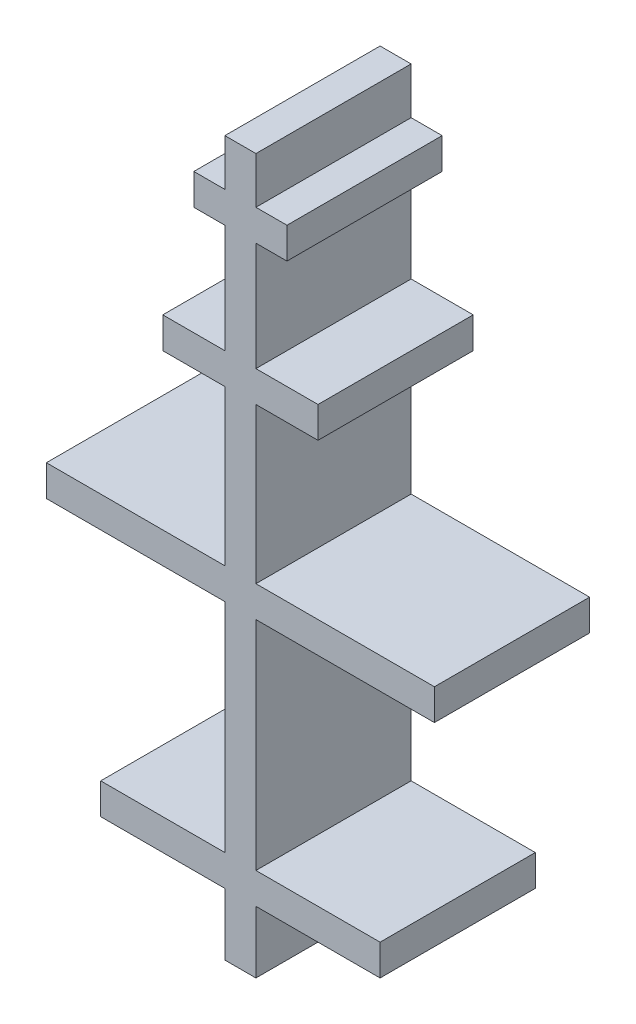
ISO-10303-21;
HEADER;
FILE_DESCRIPTION(('STEP AP214'),'2;1');
FILE_NAME('part.step','',(''),(''),'','','');
FILE_SCHEMA(('AUTOMOTIVE_DESIGN { 1 0 10303 214 1 1 1 1 }'));
ENDSEC;
DATA;
#1=APPLICATION_CONTEXT('core data for automotive mechanical design processes');
#2=APPLICATION_PROTOCOL_DEFINITION('international standard','automotive_design',2000,#1);
#3=PRODUCT_CONTEXT('',#1,'mechanical');
#4=PRODUCT('Part','Part','',(#3));
#5=PRODUCT_RELATED_PRODUCT_CATEGORY('part','',(#4));
#6=PRODUCT_DEFINITION_FORMATION('','',#4);
#7=PRODUCT_DEFINITION_CONTEXT('part definition',#1,'design');
#8=PRODUCT_DEFINITION('design','',#6,#7);
#9=PRODUCT_DEFINITION_SHAPE('','',#8);
#10=(LENGTH_UNIT() NAMED_UNIT(*) SI_UNIT(.MILLI.,.METRE.));
#11=(NAMED_UNIT(*) PLANE_ANGLE_UNIT() SI_UNIT($,.RADIAN.));
#12=(NAMED_UNIT(*) SI_UNIT($,.STERADIAN.) SOLID_ANGLE_UNIT());
#13=UNCERTAINTY_MEASURE_WITH_UNIT(LENGTH_MEASURE(1.E-05),#10,'distance_accuracy_value','');
#14=(GEOMETRIC_REPRESENTATION_CONTEXT(3) GLOBAL_UNCERTAINTY_ASSIGNED_CONTEXT((#13)) GLOBAL_UNIT_ASSIGNED_CONTEXT((#10,
#11,#12)) REPRESENTATION_CONTEXT('',''));
#15=CARTESIAN_POINT('',(0.,0.,0.));
#16=DIRECTION('',(0.,0.,1.));
#17=DIRECTION('',(1.,0.,0.));
#18=AXIS2_PLACEMENT_3D('',#15,#16,#17);
#19=CARTESIAN_POINT('',(0.,0.,50.));
#20=DIRECTION('',(1.,0.,0.));
#21=DIRECTION('',(0.,1.,0.));
#22=AXIS2_PLACEMENT_3D('',#19,#20,#21);
#23=PLANE('',#22);
#24=DIRECTION('',(0.,-1.,0.));
#25=VECTOR('',#24,1.);
#26=CARTESIAN_POINT('',(0.,0.,0.));
#27=LINE('',#26,#25);
#28=CARTESIAN_POINT('',(0.,20.,0.));
#29=VERTEX_POINT('',#28);
#30=CARTESIAN_POINT('',(0.,0.,0.));
#31=VERTEX_POINT('',#30);
#32=EDGE_CURVE('E308',#29,#31,#27,.T.);
#33=ORIENTED_EDGE('',*,*,#32,.T.);
#34=DIRECTION('',(0.,0.,-1.));
#35=VECTOR('',#34,1.);
#36=CARTESIAN_POINT('',(0.,0.,50.));
#37=LINE('',#36,#35);
#38=CARTESIAN_POINT('',(0.,0.,50.));
#39=VERTEX_POINT('',#38);
#40=EDGE_CURVE('E11',#39,#31,#37,.T.);
#41=ORIENTED_EDGE('',*,*,#40,.F.);
#42=DIRECTION('',(0.,-1.,0.));
#43=VECTOR('',#42,1.);
#44=CARTESIAN_POINT('',(0.,0.,50.));
#45=LINE('',#44,#43);
#46=CARTESIAN_POINT('',(0.,20.,50.));
#47=VERTEX_POINT('',#46);
#48=EDGE_CURVE('E414',#47,#39,#45,.T.);
#49=ORIENTED_EDGE('',*,*,#48,.F.);
#50=DIRECTION('',(0.,0.,-1.));
#51=VECTOR('',#50,1.);
#52=CARTESIAN_POINT('',(0.,20.,50.));
#53=LINE('',#52,#51);
#54=EDGE_CURVE('E304',#47,#29,#53,.T.);
#55=ORIENTED_EDGE('',*,*,#54,.T.);
#56=EDGE_LOOP('',(#33,#41,#49,#55));
#57=FACE_BOUND('',#56,.T.);
#58=ADVANCED_FACE('F39',(#57),#23,.F.);
#59=CARTESIAN_POINT('',(0.,0.,50.));
#60=DIRECTION('',(0.,1.,0.));
#61=DIRECTION('',(0.,0.,1.));
#62=AXIS2_PLACEMENT_3D('',#59,#60,#61);
#63=PLANE('',#62);
#64=DIRECTION('',(1.,0.,0.));
#65=VECTOR('',#64,1.);
#66=CARTESIAN_POINT('',(0.,0.,0.));
#67=LINE('',#66,#65);
#68=CARTESIAN_POINT('',(10.,0.,0.));
#69=VERTEX_POINT('',#68);
#70=EDGE_CURVE('E312',#31,#69,#67,.T.);
#71=ORIENTED_EDGE('',*,*,#70,.T.);
#72=DIRECTION('',(0.,0.,-1.));
#73=VECTOR('',#72,1.);
#74=CARTESIAN_POINT('',(10.,0.,50.));
#75=LINE('',#74,#73);
#76=CARTESIAN_POINT('',(10.,0.,50.));
#77=VERTEX_POINT('',#76);
#78=EDGE_CURVE('E48',#77,#69,#75,.T.);
#79=ORIENTED_EDGE('',*,*,#78,.F.);
#80=DIRECTION('',(1.,0.,0.));
#81=VECTOR('',#80,1.);
#82=CARTESIAN_POINT('',(0.,0.,50.));
#83=LINE('',#82,#81);
#84=EDGE_CURVE('E183',#39,#77,#83,.T.);
#85=ORIENTED_EDGE('',*,*,#84,.F.);
#86=ORIENTED_EDGE('',*,*,#40,.T.);
#87=EDGE_LOOP('',(#71,#79,#85,#86));
#88=FACE_BOUND('',#87,.T.);
#89=ADVANCED_FACE('F676',(#88),#63,.F.);
#90=CARTESIAN_POINT('',(10.,0.,50.));
#91=DIRECTION('',(-1.,0.,0.));
#92=DIRECTION('',(0.,-1.,0.));
#93=AXIS2_PLACEMENT_3D('',#90,#91,#92);
#94=PLANE('',#93);
#95=DIRECTION('',(0.,1.,0.));
#96=VECTOR('',#95,1.);
#97=CARTESIAN_POINT('',(10.,0.,0.));
#98=LINE('',#97,#96);
#99=CARTESIAN_POINT('',(9.99999999999999,20.,0.));
#100=VERTEX_POINT('',#99);
#101=EDGE_CURVE('E315',#69,#100,#98,.T.);
#102=ORIENTED_EDGE('',*,*,#101,.T.);
#103=DIRECTION('',(0.,0.,-1.));
#104=VECTOR('',#103,1.);
#105=CARTESIAN_POINT('',(9.99999999999999,20.,50.));
#106=LINE('',#105,#104);
#107=CARTESIAN_POINT('',(9.99999999999999,20.,50.));
#108=VERTEX_POINT('',#107);
#109=EDGE_CURVE('E537',#108,#100,#106,.T.);
#110=ORIENTED_EDGE('',*,*,#109,.F.);
#111=DIRECTION('',(0.,1.,0.));
#112=VECTOR('',#111,1.);
#113=CARTESIAN_POINT('',(10.,0.,50.));
#114=LINE('',#113,#112);
#115=EDGE_CURVE('E547',#77,#108,#114,.T.);
#116=ORIENTED_EDGE('',*,*,#115,.F.);
#117=ORIENTED_EDGE('',*,*,#78,.T.);
#118=EDGE_LOOP('',(#102,#110,#116,#117));
#119=FACE_BOUND('',#118,.T.);
#120=ADVANCED_FACE('F545',(#119),#94,.F.);
#121=CARTESIAN_POINT('',(9.99999999999999,20.,50.));
#122=DIRECTION('',(0.,1.,0.));
#123=DIRECTION('',(0.,0.,1.));
#124=AXIS2_PLACEMENT_3D('',#121,#122,#123);
#125=PLANE('',#124);
#126=DIRECTION('',(1.,0.,0.));
#127=VECTOR('',#126,1.);
#128=CARTESIAN_POINT('',(9.99999999999999,20.,0.));
#129=LINE('',#128,#127);
#130=CARTESIAN_POINT('',(50.,20.,0.));
#131=VERTEX_POINT('',#130);
#132=EDGE_CURVE('E318',#100,#131,#129,.T.);
#133=ORIENTED_EDGE('',*,*,#132,.T.);
#134=DIRECTION('',(0.,0.,-1.));
#135=VECTOR('',#134,1.);
#136=CARTESIAN_POINT('',(50.,20.,50.));
#137=LINE('',#136,#135);
#138=CARTESIAN_POINT('',(50.,20.,50.));
#139=VERTEX_POINT('',#138);
#140=EDGE_CURVE('E533',#139,#131,#137,.T.);
#141=ORIENTED_EDGE('',*,*,#140,.F.);
#142=DIRECTION('',(1.,0.,0.));
#143=VECTOR('',#142,1.);
#144=CARTESIAN_POINT('',(9.99999999999999,20.,50.));
#145=LINE('',#144,#143);
#146=EDGE_CURVE('E566',#108,#139,#145,.T.);
#147=ORIENTED_EDGE('',*,*,#146,.F.);
#148=ORIENTED_EDGE('',*,*,#109,.T.);
#149=EDGE_LOOP('',(#133,#141,#147,#148));
#150=FACE_BOUND('',#149,.T.);
#151=ADVANCED_FACE('F556',(#150),#125,.F.);
#152=CARTESIAN_POINT('',(50.,30.,50.));
#153=DIRECTION('',(-1.,0.,0.));
#154=DIRECTION('',(0.,0.,1.));
#155=AXIS2_PLACEMENT_3D('',#152,#153,#154);
#156=PLANE('',#155);
#157=DIRECTION('',(0.,1.,0.));
#158=VECTOR('',#157,1.);
#159=CARTESIAN_POINT('',(50.,30.,0.));
#160=LINE('',#159,#158);
#161=CARTESIAN_POINT('',(50.,30.,0.));
#162=VERTEX_POINT('',#161);
#163=EDGE_CURVE('E321',#131,#162,#160,.T.);
#164=ORIENTED_EDGE('',*,*,#163,.T.);
#165=DIRECTION('',(0.,0.,-1.));
#166=VECTOR('',#165,1.);
#167=CARTESIAN_POINT('',(50.,30.,50.));
#168=LINE('',#167,#166);
#169=CARTESIAN_POINT('',(50.,30.,50.));
#170=VERTEX_POINT('',#169);
#171=EDGE_CURVE('E529',#170,#162,#168,.T.);
#172=ORIENTED_EDGE('',*,*,#171,.F.);
#173=DIRECTION('',(0.,1.,0.));
#174=VECTOR('',#173,1.);
#175=CARTESIAN_POINT('',(50.,30.,50.));
#176=LINE('',#175,#174);
#177=EDGE_CURVE('E562',#139,#170,#176,.T.);
#178=ORIENTED_EDGE('',*,*,#177,.F.);
#179=ORIENTED_EDGE('',*,*,#140,.T.);
#180=EDGE_LOOP('',(#164,#172,#178,#179));
#181=FACE_BOUND('',#180,.T.);
#182=ADVANCED_FACE('F560',(#181),#156,.F.);
#183=CARTESIAN_POINT('',(9.99999999999999,30.,50.));
#184=DIRECTION('',(0.,-1.,0.));
#185=DIRECTION('',(1.,0.,0.));
#186=AXIS2_PLACEMENT_3D('',#183,#184,#185);
#187=PLANE('',#186);
#188=DIRECTION('',(-1.,0.,0.));
#189=VECTOR('',#188,1.);
#190=CARTESIAN_POINT('',(9.99999999999999,30.,0.));
#191=LINE('',#190,#189);
#192=CARTESIAN_POINT('',(9.99999999999999,30.,0.));
#193=VERTEX_POINT('',#192);
#194=EDGE_CURVE('E324',#162,#193,#191,.T.);
#195=ORIENTED_EDGE('',*,*,#194,.T.);
#196=DIRECTION('',(0.,0.,-1.));
#197=VECTOR('',#196,1.);
#198=CARTESIAN_POINT('',(9.99999999999999,30.,50.));
#199=LINE('',#198,#197);
#200=CARTESIAN_POINT('',(9.99999999999999,30.,50.));
#201=VERTEX_POINT('',#200);
#202=EDGE_CURVE('E525',#201,#193,#199,.T.);
#203=ORIENTED_EDGE('',*,*,#202,.F.);
#204=DIRECTION('',(-1.,0.,0.));
#205=VECTOR('',#204,1.);
#206=CARTESIAN_POINT('',(9.99999999999999,30.,50.));
#207=LINE('',#206,#205);
#208=EDGE_CURVE('E565',#170,#201,#207,.T.);
#209=ORIENTED_EDGE('',*,*,#208,.F.);
#210=ORIENTED_EDGE('',*,*,#171,.T.);
#211=EDGE_LOOP('',(#195,#203,#209,#210));
#212=FACE_BOUND('',#211,.T.);
#213=ADVANCED_FACE('F689',(#212),#187,.F.);
#214=CARTESIAN_POINT('',(9.99999999999999,30.,50.));
#215=DIRECTION('',(-1.,0.,0.));
#216=DIRECTION('',(0.,-1.,0.));
#217=AXIS2_PLACEMENT_3D('',#214,#215,#216);
#218=PLANE('',#217);
#219=DIRECTION('',(0.,1.,0.));
#220=VECTOR('',#219,1.);
#221=CARTESIAN_POINT('',(9.99999999999999,30.,0.));
#222=LINE('',#221,#220);
#223=CARTESIAN_POINT('',(10.,100.,0.));
#224=VERTEX_POINT('',#223);
#225=EDGE_CURVE('E327',#193,#224,#222,.T.);
#226=ORIENTED_EDGE('',*,*,#225,.T.);
#227=DIRECTION('',(0.,0.,-1.));
#228=VECTOR('',#227,1.);
#229=CARTESIAN_POINT('',(10.,100.,50.));
#230=LINE('',#229,#228);
#231=CARTESIAN_POINT('',(10.,100.,50.));
#232=VERTEX_POINT('',#231);
#233=EDGE_CURVE('E521',#232,#224,#230,.T.);
#234=ORIENTED_EDGE('',*,*,#233,.F.);
#235=DIRECTION('',(0.,1.,0.));
#236=VECTOR('',#235,1.);
#237=CARTESIAN_POINT('',(9.99999999999999,30.,50.));
#238=LINE('',#237,#236);
#239=EDGE_CURVE('E570',#201,#232,#238,.T.);
#240=ORIENTED_EDGE('',*,*,#239,.F.);
#241=ORIENTED_EDGE('',*,*,#202,.T.);
#242=EDGE_LOOP('',(#226,#234,#240,#241));
#243=FACE_BOUND('',#242,.T.);
#244=ADVANCED_FACE('F692',(#243),#218,.F.);
#245=CARTESIAN_POINT('',(10.,100.,50.));
#246=DIRECTION('',(0.,1.,0.));
#247=DIRECTION('',(0.,0.,1.));
#248=AXIS2_PLACEMENT_3D('',#245,#246,#247);
#249=PLANE('',#248);
#250=DIRECTION('',(1.,0.,0.));
#251=VECTOR('',#250,1.);
#252=CARTESIAN_POINT('',(10.,100.,0.));
#253=LINE('',#252,#251);
#254=CARTESIAN_POINT('',(67.5,100.,0.));
#255=VERTEX_POINT('',#254);
#256=EDGE_CURVE('E330',#224,#255,#253,.T.);
#257=ORIENTED_EDGE('',*,*,#256,.T.);
#258=DIRECTION('',(0.,0.,-1.));
#259=VECTOR('',#258,1.);
#260=CARTESIAN_POINT('',(67.5,100.,50.));
#261=LINE('',#260,#259);
#262=CARTESIAN_POINT('',(67.5,100.,50.));
#263=VERTEX_POINT('',#262);
#264=EDGE_CURVE('E517',#263,#255,#261,.T.);
#265=ORIENTED_EDGE('',*,*,#264,.F.);
#266=DIRECTION('',(1.,0.,0.));
#267=VECTOR('',#266,1.);
#268=CARTESIAN_POINT('',(10.,100.,50.));
#269=LINE('',#268,#267);
#270=EDGE_CURVE('E577',#232,#263,#269,.T.);
#271=ORIENTED_EDGE('',*,*,#270,.F.);
#272=ORIENTED_EDGE('',*,*,#233,.T.);
#273=EDGE_LOOP('',(#257,#265,#271,#272));
#274=FACE_BOUND('',#273,.T.);
#275=ADVANCED_FACE('F696',(#274),#249,.F.);
#276=CARTESIAN_POINT('',(67.5,110.,50.));
#277=DIRECTION('',(-1.,0.,0.));
#278=DIRECTION('',(0.,0.,1.));
#279=AXIS2_PLACEMENT_3D('',#276,#277,#278);
#280=PLANE('',#279);
#281=DIRECTION('',(0.,1.,0.));
#282=VECTOR('',#281,1.);
#283=CARTESIAN_POINT('',(67.5,110.,0.));
#284=LINE('',#283,#282);
#285=CARTESIAN_POINT('',(67.5,110.,0.));
#286=VERTEX_POINT('',#285);
#287=EDGE_CURVE('E333',#255,#286,#284,.T.);
#288=ORIENTED_EDGE('',*,*,#287,.T.);
#289=DIRECTION('',(0.,0.,-1.));
#290=VECTOR('',#289,1.);
#291=CARTESIAN_POINT('',(67.5,110.,50.));
#292=LINE('',#291,#290);
#293=CARTESIAN_POINT('',(67.5,110.,50.));
#294=VERTEX_POINT('',#293);
#295=EDGE_CURVE('E513',#294,#286,#292,.T.);
#296=ORIENTED_EDGE('',*,*,#295,.F.);
#297=DIRECTION('',(0.,1.,0.));
#298=VECTOR('',#297,1.);
#299=CARTESIAN_POINT('',(67.5,110.,50.));
#300=LINE('',#299,#298);
#301=EDGE_CURVE('E580',#263,#294,#300,.T.);
#302=ORIENTED_EDGE('',*,*,#301,.F.);
#303=ORIENTED_EDGE('',*,*,#264,.T.);
#304=EDGE_LOOP('',(#288,#296,#302,#303));
#305=FACE_BOUND('',#304,.T.);
#306=ADVANCED_FACE('F700',(#305),#280,.F.);
#307=CARTESIAN_POINT('',(10.,110.,50.));
#308=DIRECTION('',(0.,-1.,0.));
#309=DIRECTION('',(0.,0.,-1.));
#310=AXIS2_PLACEMENT_3D('',#307,#308,#309);
#311=PLANE('',#310);
#312=DIRECTION('',(-1.,0.,0.));
#313=VECTOR('',#312,1.);
#314=CARTESIAN_POINT('',(10.,110.,0.));
#315=LINE('',#314,#313);
#316=CARTESIAN_POINT('',(10.,110.,0.));
#317=VERTEX_POINT('',#316);
#318=EDGE_CURVE('E336',#286,#317,#315,.T.);
#319=ORIENTED_EDGE('',*,*,#318,.T.);
#320=DIRECTION('',(0.,0.,-1.));
#321=VECTOR('',#320,1.);
#322=CARTESIAN_POINT('',(10.,110.,50.));
#323=LINE('',#322,#321);
#324=CARTESIAN_POINT('',(10.,110.,50.));
#325=VERTEX_POINT('',#324);
#326=EDGE_CURVE('E509',#325,#317,#323,.T.);
#327=ORIENTED_EDGE('',*,*,#326,.F.);
#328=DIRECTION('',(-1.,0.,0.));
#329=VECTOR('',#328,1.);
#330=CARTESIAN_POINT('',(10.,110.,50.));
#331=LINE('',#330,#329);
#332=EDGE_CURVE('E583',#294,#325,#331,.T.);
#333=ORIENTED_EDGE('',*,*,#332,.F.);
#334=ORIENTED_EDGE('',*,*,#295,.T.);
#335=EDGE_LOOP('',(#319,#327,#333,#334));
#336=FACE_BOUND('',#335,.T.);
#337=ADVANCED_FACE('F704',(#336),#311,.F.);
#338=CARTESIAN_POINT('',(10.,110.,50.));
#339=DIRECTION('',(-1.,0.,0.));
#340=DIRECTION('',(0.,0.,1.));
#341=AXIS2_PLACEMENT_3D('',#338,#339,#340);
#342=PLANE('',#341);
#343=DIRECTION('',(0.,1.,0.));
#344=VECTOR('',#343,1.);
#345=CARTESIAN_POINT('',(10.,110.,0.));
#346=LINE('',#345,#344);
#347=CARTESIAN_POINT('',(10.,160.,0.));
#348=VERTEX_POINT('',#347);
#349=EDGE_CURVE('E339',#317,#348,#346,.T.);
#350=ORIENTED_EDGE('',*,*,#349,.T.);
#351=DIRECTION('',(0.,0.,-1.));
#352=VECTOR('',#351,1.);
#353=CARTESIAN_POINT('',(10.,160.,50.));
#354=LINE('',#353,#352);
#355=CARTESIAN_POINT('',(10.,160.,50.));
#356=VERTEX_POINT('',#355);
#357=EDGE_CURVE('E505',#356,#348,#354,.T.);
#358=ORIENTED_EDGE('',*,*,#357,.F.);
#359=DIRECTION('',(0.,1.,0.));
#360=VECTOR('',#359,1.);
#361=CARTESIAN_POINT('',(10.,110.,50.));
#362=LINE('',#361,#360);
#363=EDGE_CURVE('E586',#325,#356,#362,.T.);
#364=ORIENTED_EDGE('',*,*,#363,.F.);
#365=ORIENTED_EDGE('',*,*,#326,.T.);
#366=EDGE_LOOP('',(#350,#358,#364,#365));
#367=FACE_BOUND('',#366,.T.);
#368=ADVANCED_FACE('F708',(#367),#342,.F.);
#369=CARTESIAN_POINT('',(10.,160.,50.));
#370=DIRECTION('',(0.,1.,0.));
#371=DIRECTION('',(0.,0.,1.));
#372=AXIS2_PLACEMENT_3D('',#369,#370,#371);
#373=PLANE('',#372);
#374=DIRECTION('',(1.,0.,0.));
#375=VECTOR('',#374,1.);
#376=CARTESIAN_POINT('',(10.,160.,0.));
#377=LINE('',#376,#375);
#378=CARTESIAN_POINT('',(30.,160.,0.));
#379=VERTEX_POINT('',#378);
#380=EDGE_CURVE('E342',#348,#379,#377,.T.);
#381=ORIENTED_EDGE('',*,*,#380,.T.);
#382=DIRECTION('',(0.,0.,-1.));
#383=VECTOR('',#382,1.);
#384=CARTESIAN_POINT('',(30.,160.,50.));
#385=LINE('',#384,#383);
#386=CARTESIAN_POINT('',(30.,160.,50.));
#387=VERTEX_POINT('',#386);
#388=EDGE_CURVE('E501',#387,#379,#385,.T.);
#389=ORIENTED_EDGE('',*,*,#388,.F.);
#390=DIRECTION('',(1.,0.,0.));
#391=VECTOR('',#390,1.);
#392=CARTESIAN_POINT('',(10.,160.,50.));
#393=LINE('',#392,#391);
#394=EDGE_CURVE('E589',#356,#387,#393,.T.);
#395=ORIENTED_EDGE('',*,*,#394,.F.);
#396=ORIENTED_EDGE('',*,*,#357,.T.);
#397=EDGE_LOOP('',(#381,#389,#395,#396));
#398=FACE_BOUND('',#397,.T.);
#399=ADVANCED_FACE('F712',(#398),#373,.F.);
#400=CARTESIAN_POINT('',(30.,170.,50.));
#401=DIRECTION('',(-1.,0.,0.));
#402=DIRECTION('',(0.,0.,1.));
#403=AXIS2_PLACEMENT_3D('',#400,#401,#402);
#404=PLANE('',#403);
#405=DIRECTION('',(0.,1.,0.));
#406=VECTOR('',#405,1.);
#407=CARTESIAN_POINT('',(30.,170.,0.));
#408=LINE('',#407,#406);
#409=CARTESIAN_POINT('',(30.,170.,0.));
#410=VERTEX_POINT('',#409);
#411=EDGE_CURVE('E345',#379,#410,#408,.T.);
#412=ORIENTED_EDGE('',*,*,#411,.T.);
#413=DIRECTION('',(0.,0.,-1.));
#414=VECTOR('',#413,1.);
#415=CARTESIAN_POINT('',(30.,170.,50.));
#416=LINE('',#415,#414);
#417=CARTESIAN_POINT('',(30.,170.,50.));
#418=VERTEX_POINT('',#417);
#419=EDGE_CURVE('E497',#418,#410,#416,.T.);
#420=ORIENTED_EDGE('',*,*,#419,.F.);
#421=DIRECTION('',(0.,1.,0.));
#422=VECTOR('',#421,1.);
#423=CARTESIAN_POINT('',(30.,170.,50.));
#424=LINE('',#423,#422);
#425=EDGE_CURVE('E592',#387,#418,#424,.T.);
#426=ORIENTED_EDGE('',*,*,#425,.F.);
#427=ORIENTED_EDGE('',*,*,#388,.T.);
#428=EDGE_LOOP('',(#412,#420,#426,#427));
#429=FACE_BOUND('',#428,.T.);
#430=ADVANCED_FACE('F716',(#429),#404,.F.);
#431=CARTESIAN_POINT('',(10.,170.,50.));
#432=DIRECTION('',(0.,-1.,0.));
#433=DIRECTION('',(0.,0.,-1.));
#434=AXIS2_PLACEMENT_3D('',#431,#432,#433);
#435=PLANE('',#434);
#436=DIRECTION('',(-1.,0.,0.));
#437=VECTOR('',#436,1.);
#438=CARTESIAN_POINT('',(10.,170.,0.));
#439=LINE('',#438,#437);
#440=CARTESIAN_POINT('',(10.,170.,0.));
#441=VERTEX_POINT('',#440);
#442=EDGE_CURVE('E348',#410,#441,#439,.T.);
#443=ORIENTED_EDGE('',*,*,#442,.T.);
#444=DIRECTION('',(0.,0.,-1.));
#445=VECTOR('',#444,1.);
#446=CARTESIAN_POINT('',(10.,170.,50.));
#447=LINE('',#446,#445);
#448=CARTESIAN_POINT('',(10.,170.,50.));
#449=VERTEX_POINT('',#448);
#450=EDGE_CURVE('E493',#449,#441,#447,.T.);
#451=ORIENTED_EDGE('',*,*,#450,.F.);
#452=DIRECTION('',(-1.,0.,0.));
#453=VECTOR('',#452,1.);
#454=CARTESIAN_POINT('',(10.,170.,50.));
#455=LINE('',#454,#453);
#456=EDGE_CURVE('E595',#418,#449,#455,.T.);
#457=ORIENTED_EDGE('',*,*,#456,.F.);
#458=ORIENTED_EDGE('',*,*,#419,.T.);
#459=EDGE_LOOP('',(#443,#451,#457,#458));
#460=FACE_BOUND('',#459,.T.);
#461=ADVANCED_FACE('F720',(#460),#435,.F.);
#462=CARTESIAN_POINT('',(10.,170.,50.));
#463=DIRECTION('',(-1.,0.,0.));
#464=DIRECTION('',(0.,0.,1.));
#465=AXIS2_PLACEMENT_3D('',#462,#463,#464);
#466=PLANE('',#465);
#467=DIRECTION('',(0.,1.,0.));
#468=VECTOR('',#467,1.);
#469=CARTESIAN_POINT('',(10.,170.,0.));
#470=LINE('',#469,#468);
#471=CARTESIAN_POINT('',(10.,205.,0.));
#472=VERTEX_POINT('',#471);
#473=EDGE_CURVE('E351',#441,#472,#470,.T.);
#474=ORIENTED_EDGE('',*,*,#473,.T.);
#475=DIRECTION('',(0.,0.,-1.));
#476=VECTOR('',#475,1.);
#477=CARTESIAN_POINT('',(10.,205.,50.));
#478=LINE('',#477,#476);
#479=CARTESIAN_POINT('',(10.,205.,50.));
#480=VERTEX_POINT('',#479);
#481=EDGE_CURVE('E489',#480,#472,#478,.T.);
#482=ORIENTED_EDGE('',*,*,#481,.F.);
#483=DIRECTION('',(0.,1.,0.));
#484=VECTOR('',#483,1.);
#485=CARTESIAN_POINT('',(10.,170.,50.));
#486=LINE('',#485,#484);
#487=EDGE_CURVE('E598',#449,#480,#486,.T.);
#488=ORIENTED_EDGE('',*,*,#487,.F.);
#489=ORIENTED_EDGE('',*,*,#450,.T.);
#490=EDGE_LOOP('',(#474,#482,#488,#489));
#491=FACE_BOUND('',#490,.T.);
#492=ADVANCED_FACE('F724',(#491),#466,.F.);
#493=CARTESIAN_POINT('',(10.,205.,50.));
#494=DIRECTION('',(0.,1.,0.));
#495=DIRECTION('',(0.,0.,1.));
#496=AXIS2_PLACEMENT_3D('',#493,#494,#495);
#497=PLANE('',#496);
#498=DIRECTION('',(1.,0.,0.));
#499=VECTOR('',#498,1.);
#500=CARTESIAN_POINT('',(10.,205.,0.));
#501=LINE('',#500,#499);
#502=CARTESIAN_POINT('',(20.,205.,0.));
#503=VERTEX_POINT('',#502);
#504=EDGE_CURVE('E354',#472,#503,#501,.T.);
#505=ORIENTED_EDGE('',*,*,#504,.T.);
#506=DIRECTION('',(0.,0.,-1.));
#507=VECTOR('',#506,1.);
#508=CARTESIAN_POINT('',(20.,205.,50.));
#509=LINE('',#508,#507);
#510=CARTESIAN_POINT('',(20.,205.,50.));
#511=VERTEX_POINT('',#510);
#512=EDGE_CURVE('E485',#511,#503,#509,.T.);
#513=ORIENTED_EDGE('',*,*,#512,.F.);
#514=DIRECTION('',(1.,0.,0.));
#515=VECTOR('',#514,1.);
#516=CARTESIAN_POINT('',(10.,205.,50.));
#517=LINE('',#516,#515);
#518=EDGE_CURVE('E601',#480,#511,#517,.T.);
#519=ORIENTED_EDGE('',*,*,#518,.F.);
#520=ORIENTED_EDGE('',*,*,#481,.T.);
#521=EDGE_LOOP('',(#505,#513,#519,#520));
#522=FACE_BOUND('',#521,.T.);
#523=ADVANCED_FACE('F728',(#522),#497,.F.);
#524=CARTESIAN_POINT('',(19.9999999999999,215.,50.));
#525=DIRECTION('',(-1.,0.,0.));
#526=DIRECTION('',(0.,-1.,0.));
#527=AXIS2_PLACEMENT_3D('',#524,#525,#526);
#528=PLANE('',#527);
#529=DIRECTION('',(0.,1.,0.));
#530=VECTOR('',#529,1.);
#531=CARTESIAN_POINT('',(19.9999999999999,215.,0.));
#532=LINE('',#531,#530);
#533=CARTESIAN_POINT('',(19.9999999999999,215.,0.));
#534=VERTEX_POINT('',#533);
#535=EDGE_CURVE('E357',#503,#534,#532,.T.);
#536=ORIENTED_EDGE('',*,*,#535,.T.);
#537=DIRECTION('',(0.,0.,-1.));
#538=VECTOR('',#537,1.);
#539=CARTESIAN_POINT('',(19.9999999999999,215.,50.));
#540=LINE('',#539,#538);
#541=CARTESIAN_POINT('',(19.9999999999999,215.,50.));
#542=VERTEX_POINT('',#541);
#543=EDGE_CURVE('E481',#542,#534,#540,.T.);
#544=ORIENTED_EDGE('',*,*,#543,.F.);
#545=DIRECTION('',(0.,1.,0.));
#546=VECTOR('',#545,1.);
#547=CARTESIAN_POINT('',(19.9999999999999,215.,50.));
#548=LINE('',#547,#546);
#549=EDGE_CURVE('E604',#511,#542,#548,.T.);
#550=ORIENTED_EDGE('',*,*,#549,.F.);
#551=ORIENTED_EDGE('',*,*,#512,.T.);
#552=EDGE_LOOP('',(#536,#544,#550,#551));
#553=FACE_BOUND('',#552,.T.);
#554=ADVANCED_FACE('F732',(#553),#528,.F.);
#555=CARTESIAN_POINT('',(10.,215.,50.));
#556=DIRECTION('',(0.,-1.,0.));
#557=DIRECTION('',(0.,0.,-1.));
#558=AXIS2_PLACEMENT_3D('',#555,#556,#557);
#559=PLANE('',#558);
#560=DIRECTION('',(-1.,0.,0.));
#561=VECTOR('',#560,1.);
#562=CARTESIAN_POINT('',(10.,215.,0.));
#563=LINE('',#562,#561);
#564=CARTESIAN_POINT('',(10.,215.,0.));
#565=VERTEX_POINT('',#564);
#566=EDGE_CURVE('E360',#534,#565,#563,.T.);
#567=ORIENTED_EDGE('',*,*,#566,.T.);
#568=DIRECTION('',(0.,0.,-1.));
#569=VECTOR('',#568,1.);
#570=CARTESIAN_POINT('',(10.,215.,50.));
#571=LINE('',#570,#569);
#572=CARTESIAN_POINT('',(10.,215.,50.));
#573=VERTEX_POINT('',#572);
#574=EDGE_CURVE('E477',#573,#565,#571,.T.);
#575=ORIENTED_EDGE('',*,*,#574,.F.);
#576=DIRECTION('',(-1.,0.,0.));
#577=VECTOR('',#576,1.);
#578=CARTESIAN_POINT('',(10.,215.,50.));
#579=LINE('',#578,#577);
#580=EDGE_CURVE('E607',#542,#573,#579,.T.);
#581=ORIENTED_EDGE('',*,*,#580,.F.);
#582=ORIENTED_EDGE('',*,*,#543,.T.);
#583=EDGE_LOOP('',(#567,#575,#581,#582));
#584=FACE_BOUND('',#583,.T.);
#585=ADVANCED_FACE('F736',(#584),#559,.F.);
#586=CARTESIAN_POINT('',(10.,215.,50.));
#587=DIRECTION('',(-1.,0.,0.));
#588=DIRECTION('',(0.,0.,1.));
#589=AXIS2_PLACEMENT_3D('',#586,#587,#588);
#590=PLANE('',#589);
#591=DIRECTION('',(0.,1.,0.));
#592=VECTOR('',#591,1.);
#593=CARTESIAN_POINT('',(10.,215.,0.));
#594=LINE('',#593,#592);
#595=CARTESIAN_POINT('',(10.,230.,0.));
#596=VERTEX_POINT('',#595);
#597=EDGE_CURVE('E363',#565,#596,#594,.T.);
#598=ORIENTED_EDGE('',*,*,#597,.T.);
#599=DIRECTION('',(0.,0.,-1.));
#600=VECTOR('',#599,1.);
#601=CARTESIAN_POINT('',(10.,230.,50.));
#602=LINE('',#601,#600);
#603=CARTESIAN_POINT('',(10.,230.,50.));
#604=VERTEX_POINT('',#603);
#605=EDGE_CURVE('E473',#604,#596,#602,.T.);
#606=ORIENTED_EDGE('',*,*,#605,.F.);
#607=DIRECTION('',(0.,1.,0.));
#608=VECTOR('',#607,1.);
#609=CARTESIAN_POINT('',(10.,215.,50.));
#610=LINE('',#609,#608);
#611=EDGE_CURVE('E610',#573,#604,#610,.T.);
#612=ORIENTED_EDGE('',*,*,#611,.F.);
#613=ORIENTED_EDGE('',*,*,#574,.T.);
#614=EDGE_LOOP('',(#598,#606,#612,#613));
#615=FACE_BOUND('',#614,.T.);
#616=ADVANCED_FACE('F740',(#615),#590,.F.);
#617=CARTESIAN_POINT('',(0.,230.,50.));
#618=DIRECTION('',(0.,-1.,0.));
#619=DIRECTION('',(0.,0.,-1.));
#620=AXIS2_PLACEMENT_3D('',#617,#618,#619);
#621=PLANE('',#620);
#622=DIRECTION('',(-1.,0.,0.));
#623=VECTOR('',#622,1.);
#624=CARTESIAN_POINT('',(0.,230.,0.));
#625=LINE('',#624,#623);
#626=CARTESIAN_POINT('',(0.,230.,0.));
#627=VERTEX_POINT('',#626);
#628=EDGE_CURVE('E366',#596,#627,#625,.T.);
#629=ORIENTED_EDGE('',*,*,#628,.T.);
#630=DIRECTION('',(0.,0.,-1.));
#631=VECTOR('',#630,1.);
#632=CARTESIAN_POINT('',(0.,230.,50.));
#633=LINE('',#632,#631);
#634=CARTESIAN_POINT('',(0.,230.,50.));
#635=VERTEX_POINT('',#634);
#636=EDGE_CURVE('E469',#635,#627,#633,.T.);
#637=ORIENTED_EDGE('',*,*,#636,.F.);
#638=DIRECTION('',(-1.,0.,0.));
#639=VECTOR('',#638,1.);
#640=CARTESIAN_POINT('',(0.,230.,50.));
#641=LINE('',#640,#639);
#642=EDGE_CURVE('E613',#604,#635,#641,.T.);
#643=ORIENTED_EDGE('',*,*,#642,.F.);
#644=ORIENTED_EDGE('',*,*,#605,.T.);
#645=EDGE_LOOP('',(#629,#637,#643,#644));
#646=FACE_BOUND('',#645,.T.);
#647=ADVANCED_FACE('F744',(#646),#621,.F.);
#648=CARTESIAN_POINT('',(0.,215.,50.));
#649=DIRECTION('',(1.,0.,0.));
#650=DIRECTION('',(0.,0.,-1.));
#651=AXIS2_PLACEMENT_3D('',#648,#649,#650);
#652=PLANE('',#651);
#653=DIRECTION('',(0.,-1.,0.));
#654=VECTOR('',#653,1.);
#655=CARTESIAN_POINT('',(0.,215.,0.));
#656=LINE('',#655,#654);
#657=CARTESIAN_POINT('',(0.,215.,0.));
#658=VERTEX_POINT('',#657);
#659=EDGE_CURVE('E369',#627,#658,#656,.T.);
#660=ORIENTED_EDGE('',*,*,#659,.T.);
#661=DIRECTION('',(0.,0.,-1.));
#662=VECTOR('',#661,1.);
#663=CARTESIAN_POINT('',(0.,215.,50.));
#664=LINE('',#663,#662);
#665=CARTESIAN_POINT('',(0.,215.,50.));
#666=VERTEX_POINT('',#665);
#667=EDGE_CURVE('E465',#666,#658,#664,.T.);
#668=ORIENTED_EDGE('',*,*,#667,.F.);
#669=DIRECTION('',(0.,-1.,0.));
#670=VECTOR('',#669,1.);
#671=CARTESIAN_POINT('',(0.,215.,50.));
#672=LINE('',#671,#670);
#673=EDGE_CURVE('E616',#635,#666,#672,.T.);
#674=ORIENTED_EDGE('',*,*,#673,.F.);
#675=ORIENTED_EDGE('',*,*,#636,.T.);
#676=EDGE_LOOP('',(#660,#668,#674,#675));
#677=FACE_BOUND('',#676,.T.);
#678=ADVANCED_FACE('F748',(#677),#652,.F.);
#679=CARTESIAN_POINT('',(-10.,215.,50.));
#680=DIRECTION('',(0.,-1.,0.));
#681=DIRECTION('',(0.,0.,-1.));
#682=AXIS2_PLACEMENT_3D('',#679,#680,#681);
#683=PLANE('',#682);
#684=DIRECTION('',(-1.,0.,0.));
#685=VECTOR('',#684,1.);
#686=CARTESIAN_POINT('',(-10.,215.,0.));
#687=LINE('',#686,#685);
#688=CARTESIAN_POINT('',(-10.,215.,0.));
#689=VERTEX_POINT('',#688);
#690=EDGE_CURVE('E372',#658,#689,#687,.T.);
#691=ORIENTED_EDGE('',*,*,#690,.T.);
#692=DIRECTION('',(0.,0.,-1.));
#693=VECTOR('',#692,1.);
#694=CARTESIAN_POINT('',(-10.,215.,50.));
#695=LINE('',#694,#693);
#696=CARTESIAN_POINT('',(-10.,215.,50.));
#697=VERTEX_POINT('',#696);
#698=EDGE_CURVE('E461',#697,#689,#695,.T.);
#699=ORIENTED_EDGE('',*,*,#698,.F.);
#700=DIRECTION('',(-1.,0.,0.));
#701=VECTOR('',#700,1.);
#702=CARTESIAN_POINT('',(-10.,215.,50.));
#703=LINE('',#702,#701);
#704=EDGE_CURVE('E619',#666,#697,#703,.T.);
#705=ORIENTED_EDGE('',*,*,#704,.F.);
#706=ORIENTED_EDGE('',*,*,#667,.T.);
#707=EDGE_LOOP('',(#691,#699,#705,#706));
#708=FACE_BOUND('',#707,.T.);
#709=ADVANCED_FACE('F752',(#708),#683,.F.);
#710=CARTESIAN_POINT('',(-10.,215.,50.));
#711=DIRECTION('',(1.,0.,0.));
#712=DIRECTION('',(0.,1.,0.));
#713=AXIS2_PLACEMENT_3D('',#710,#711,#712);
#714=PLANE('',#713);
#715=DIRECTION('',(0.,-1.,0.));
#716=VECTOR('',#715,1.);
#717=CARTESIAN_POINT('',(-10.,215.,0.));
#718=LINE('',#717,#716);
#719=CARTESIAN_POINT('',(-10.,205.,0.));
#720=VERTEX_POINT('',#719);
#721=EDGE_CURVE('E375',#689,#720,#718,.T.);
#722=ORIENTED_EDGE('',*,*,#721,.T.);
#723=DIRECTION('',(0.,0.,-1.));
#724=VECTOR('',#723,1.);
#725=CARTESIAN_POINT('',(-10.,205.,50.));
#726=LINE('',#725,#724);
#727=CARTESIAN_POINT('',(-10.,205.,50.));
#728=VERTEX_POINT('',#727);
#729=EDGE_CURVE('E457',#728,#720,#726,.T.);
#730=ORIENTED_EDGE('',*,*,#729,.F.);
#731=DIRECTION('',(0.,-1.,0.));
#732=VECTOR('',#731,1.);
#733=CARTESIAN_POINT('',(-10.,215.,50.));
#734=LINE('',#733,#732);
#735=EDGE_CURVE('E622',#697,#728,#734,.T.);
#736=ORIENTED_EDGE('',*,*,#735,.F.);
#737=ORIENTED_EDGE('',*,*,#698,.T.);
#738=EDGE_LOOP('',(#722,#730,#736,#737));
#739=FACE_BOUND('',#738,.T.);
#740=ADVANCED_FACE('F756',(#739),#714,.F.);
#741=CARTESIAN_POINT('',(-10.,205.,50.));
#742=DIRECTION('',(0.,1.,0.));
#743=DIRECTION('',(0.,0.,1.));
#744=AXIS2_PLACEMENT_3D('',#741,#742,#743);
#745=PLANE('',#744);
#746=DIRECTION('',(1.,0.,0.));
#747=VECTOR('',#746,1.);
#748=CARTESIAN_POINT('',(-10.,205.,0.));
#749=LINE('',#748,#747);
#750=CARTESIAN_POINT('',(0.,205.,0.));
#751=VERTEX_POINT('',#750);
#752=EDGE_CURVE('E378',#720,#751,#749,.T.);
#753=ORIENTED_EDGE('',*,*,#752,.T.);
#754=DIRECTION('',(0.,0.,-1.));
#755=VECTOR('',#754,1.);
#756=CARTESIAN_POINT('',(0.,205.,50.));
#757=LINE('',#756,#755);
#758=CARTESIAN_POINT('',(0.,205.,50.));
#759=VERTEX_POINT('',#758);
#760=EDGE_CURVE('E453',#759,#751,#757,.T.);
#761=ORIENTED_EDGE('',*,*,#760,.F.);
#762=DIRECTION('',(1.,0.,0.));
#763=VECTOR('',#762,1.);
#764=CARTESIAN_POINT('',(-10.,205.,50.));
#765=LINE('',#764,#763);
#766=EDGE_CURVE('E625',#728,#759,#765,.T.);
#767=ORIENTED_EDGE('',*,*,#766,.F.);
#768=ORIENTED_EDGE('',*,*,#729,.T.);
#769=EDGE_LOOP('',(#753,#761,#767,#768));
#770=FACE_BOUND('',#769,.T.);
#771=ADVANCED_FACE('F760',(#770),#745,.F.);
#772=CARTESIAN_POINT('',(0.,170.,50.));
#773=DIRECTION('',(1.,0.,0.));
#774=DIRECTION('',(0.,0.,-1.));
#775=AXIS2_PLACEMENT_3D('',#772,#773,#774);
#776=PLANE('',#775);
#777=DIRECTION('',(0.,-1.,0.));
#778=VECTOR('',#777,1.);
#779=CARTESIAN_POINT('',(0.,170.,0.));
#780=LINE('',#779,#778);
#781=CARTESIAN_POINT('',(0.,170.,0.));
#782=VERTEX_POINT('',#781);
#783=EDGE_CURVE('E381',#751,#782,#780,.T.);
#784=ORIENTED_EDGE('',*,*,#783,.T.);
#785=DIRECTION('',(0.,0.,-1.));
#786=VECTOR('',#785,1.);
#787=CARTESIAN_POINT('',(0.,170.,50.));
#788=LINE('',#787,#786);
#789=CARTESIAN_POINT('',(0.,170.,50.));
#790=VERTEX_POINT('',#789);
#791=EDGE_CURVE('E449',#790,#782,#788,.T.);
#792=ORIENTED_EDGE('',*,*,#791,.F.);
#793=DIRECTION('',(0.,-1.,0.));
#794=VECTOR('',#793,1.);
#795=CARTESIAN_POINT('',(0.,170.,50.));
#796=LINE('',#795,#794);
#797=EDGE_CURVE('E628',#759,#790,#796,.T.);
#798=ORIENTED_EDGE('',*,*,#797,.F.);
#799=ORIENTED_EDGE('',*,*,#760,.T.);
#800=EDGE_LOOP('',(#784,#792,#798,#799));
#801=FACE_BOUND('',#800,.T.);
#802=ADVANCED_FACE('F764',(#801),#776,.F.);
#803=CARTESIAN_POINT('',(-20.,170.,50.));
#804=DIRECTION('',(0.,-1.,0.));
#805=DIRECTION('',(0.,0.,-1.));
#806=AXIS2_PLACEMENT_3D('',#803,#804,#805);
#807=PLANE('',#806);
#808=DIRECTION('',(-1.,0.,0.));
#809=VECTOR('',#808,1.);
#810=CARTESIAN_POINT('',(-20.,170.,0.));
#811=LINE('',#810,#809);
#812=CARTESIAN_POINT('',(-20.,170.,0.));
#813=VERTEX_POINT('',#812);
#814=EDGE_CURVE('E384',#782,#813,#811,.T.);
#815=ORIENTED_EDGE('',*,*,#814,.T.);
#816=DIRECTION('',(0.,0.,-1.));
#817=VECTOR('',#816,1.);
#818=CARTESIAN_POINT('',(-20.,170.,50.));
#819=LINE('',#818,#817);
#820=CARTESIAN_POINT('',(-20.,170.,50.));
#821=VERTEX_POINT('',#820);
#822=EDGE_CURVE('E445',#821,#813,#819,.T.);
#823=ORIENTED_EDGE('',*,*,#822,.F.);
#824=DIRECTION('',(-1.,0.,0.));
#825=VECTOR('',#824,1.);
#826=CARTESIAN_POINT('',(-20.,170.,50.));
#827=LINE('',#826,#825);
#828=EDGE_CURVE('E631',#790,#821,#827,.T.);
#829=ORIENTED_EDGE('',*,*,#828,.F.);
#830=ORIENTED_EDGE('',*,*,#791,.T.);
#831=EDGE_LOOP('',(#815,#823,#829,#830));
#832=FACE_BOUND('',#831,.T.);
#833=ADVANCED_FACE('F768',(#832),#807,.F.);
#834=CARTESIAN_POINT('',(-20.,170.,50.));
#835=DIRECTION('',(1.,0.,0.));
#836=DIRECTION('',(0.,0.,-1.));
#837=AXIS2_PLACEMENT_3D('',#834,#835,#836);
#838=PLANE('',#837);
#839=DIRECTION('',(0.,-1.,0.));
#840=VECTOR('',#839,1.);
#841=CARTESIAN_POINT('',(-20.,170.,0.));
#842=LINE('',#841,#840);
#843=CARTESIAN_POINT('',(-20.,160.,0.));
#844=VERTEX_POINT('',#843);
#845=EDGE_CURVE('E387',#813,#844,#842,.T.);
#846=ORIENTED_EDGE('',*,*,#845,.T.);
#847=DIRECTION('',(0.,0.,-1.));
#848=VECTOR('',#847,1.);
#849=CARTESIAN_POINT('',(-20.,160.,50.));
#850=LINE('',#849,#848);
#851=CARTESIAN_POINT('',(-20.,160.,50.));
#852=VERTEX_POINT('',#851);
#853=EDGE_CURVE('E441',#852,#844,#850,.T.);
#854=ORIENTED_EDGE('',*,*,#853,.F.);
#855=DIRECTION('',(0.,-1.,0.));
#856=VECTOR('',#855,1.);
#857=CARTESIAN_POINT('',(-20.,170.,50.));
#858=LINE('',#857,#856);
#859=EDGE_CURVE('E634',#821,#852,#858,.T.);
#860=ORIENTED_EDGE('',*,*,#859,.F.);
#861=ORIENTED_EDGE('',*,*,#822,.T.);
#862=EDGE_LOOP('',(#846,#854,#860,#861));
#863=FACE_BOUND('',#862,.T.);
#864=ADVANCED_FACE('F772',(#863),#838,.F.);
#865=CARTESIAN_POINT('',(-20.,160.,50.));
#866=DIRECTION('',(0.,1.,0.));
#867=DIRECTION('',(0.,0.,1.));
#868=AXIS2_PLACEMENT_3D('',#865,#866,#867);
#869=PLANE('',#868);
#870=DIRECTION('',(1.,0.,0.));
#871=VECTOR('',#870,1.);
#872=CARTESIAN_POINT('',(-20.,160.,0.));
#873=LINE('',#872,#871);
#874=CARTESIAN_POINT('',(0.,160.,0.));
#875=VERTEX_POINT('',#874);
#876=EDGE_CURVE('E390',#844,#875,#873,.T.);
#877=ORIENTED_EDGE('',*,*,#876,.T.);
#878=DIRECTION('',(0.,0.,-1.));
#879=VECTOR('',#878,1.);
#880=CARTESIAN_POINT('',(0.,160.,50.));
#881=LINE('',#880,#879);
#882=CARTESIAN_POINT('',(0.,160.,50.));
#883=VERTEX_POINT('',#882);
#884=EDGE_CURVE('E437',#883,#875,#881,.T.);
#885=ORIENTED_EDGE('',*,*,#884,.F.);
#886=DIRECTION('',(1.,0.,0.));
#887=VECTOR('',#886,1.);
#888=CARTESIAN_POINT('',(-20.,160.,50.));
#889=LINE('',#888,#887);
#890=EDGE_CURVE('E637',#852,#883,#889,.T.);
#891=ORIENTED_EDGE('',*,*,#890,.F.);
#892=ORIENTED_EDGE('',*,*,#853,.T.);
#893=EDGE_LOOP('',(#877,#885,#891,#892));
#894=FACE_BOUND('',#893,.T.);
#895=ADVANCED_FACE('F776',(#894),#869,.F.);
#896=CARTESIAN_POINT('',(0.,110.,50.));
#897=DIRECTION('',(1.,0.,0.));
#898=DIRECTION('',(0.,0.,-1.));
#899=AXIS2_PLACEMENT_3D('',#896,#897,#898);
#900=PLANE('',#899);
#901=DIRECTION('',(0.,-1.,0.));
#902=VECTOR('',#901,1.);
#903=CARTESIAN_POINT('',(0.,110.,0.));
#904=LINE('',#903,#902);
#905=CARTESIAN_POINT('',(0.,110.,0.));
#906=VERTEX_POINT('',#905);
#907=EDGE_CURVE('E393',#875,#906,#904,.T.);
#908=ORIENTED_EDGE('',*,*,#907,.T.);
#909=DIRECTION('',(0.,0.,-1.));
#910=VECTOR('',#909,1.);
#911=CARTESIAN_POINT('',(0.,110.,50.));
#912=LINE('',#911,#910);
#913=CARTESIAN_POINT('',(0.,110.,50.));
#914=VERTEX_POINT('',#913);
#915=EDGE_CURVE('E433',#914,#906,#912,.T.);
#916=ORIENTED_EDGE('',*,*,#915,.F.);
#917=DIRECTION('',(0.,-1.,0.));
#918=VECTOR('',#917,1.);
#919=CARTESIAN_POINT('',(0.,110.,50.));
#920=LINE('',#919,#918);
#921=EDGE_CURVE('E640',#883,#914,#920,.T.);
#922=ORIENTED_EDGE('',*,*,#921,.F.);
#923=ORIENTED_EDGE('',*,*,#884,.T.);
#924=EDGE_LOOP('',(#908,#916,#922,#923));
#925=FACE_BOUND('',#924,.T.);
#926=ADVANCED_FACE('F780',(#925),#900,.F.);
#927=CARTESIAN_POINT('',(-57.5,110.,50.));
#928=DIRECTION('',(0.,-1.,0.));
#929=DIRECTION('',(0.,0.,-1.));
#930=AXIS2_PLACEMENT_3D('',#927,#928,#929);
#931=PLANE('',#930);
#932=DIRECTION('',(-1.,0.,0.));
#933=VECTOR('',#932,1.);
#934=CARTESIAN_POINT('',(-57.5,110.,0.));
#935=LINE('',#934,#933);
#936=CARTESIAN_POINT('',(-57.5,110.,0.));
#937=VERTEX_POINT('',#936);
#938=EDGE_CURVE('E396',#906,#937,#935,.T.);
#939=ORIENTED_EDGE('',*,*,#938,.T.);
#940=DIRECTION('',(0.,0.,-1.));
#941=VECTOR('',#940,1.);
#942=CARTESIAN_POINT('',(-57.5,110.,50.));
#943=LINE('',#942,#941);
#944=CARTESIAN_POINT('',(-57.5,110.,50.));
#945=VERTEX_POINT('',#944);
#946=EDGE_CURVE('E429',#945,#937,#943,.T.);
#947=ORIENTED_EDGE('',*,*,#946,.F.);
#948=DIRECTION('',(-1.,0.,0.));
#949=VECTOR('',#948,1.);
#950=CARTESIAN_POINT('',(-57.5,110.,50.));
#951=LINE('',#950,#949);
#952=EDGE_CURVE('E643',#914,#945,#951,.T.);
#953=ORIENTED_EDGE('',*,*,#952,.F.);
#954=ORIENTED_EDGE('',*,*,#915,.T.);
#955=EDGE_LOOP('',(#939,#947,#953,#954));
#956=FACE_BOUND('',#955,.T.);
#957=ADVANCED_FACE('F784',(#956),#931,.F.);
#958=CARTESIAN_POINT('',(-57.5,110.,50.));
#959=DIRECTION('',(1.,0.,0.));
#960=DIRECTION('',(0.,0.,-1.));
#961=AXIS2_PLACEMENT_3D('',#958,#959,#960);
#962=PLANE('',#961);
#963=DIRECTION('',(0.,-1.,0.));
#964=VECTOR('',#963,1.);
#965=CARTESIAN_POINT('',(-57.5,110.,0.));
#966=LINE('',#965,#964);
#967=CARTESIAN_POINT('',(-57.5,100.,0.));
#968=VERTEX_POINT('',#967);
#969=EDGE_CURVE('E399',#937,#968,#966,.T.);
#970=ORIENTED_EDGE('',*,*,#969,.T.);
#971=DIRECTION('',(0.,0.,-1.));
#972=VECTOR('',#971,1.);
#973=CARTESIAN_POINT('',(-57.5,100.,50.));
#974=LINE('',#973,#972);
#975=CARTESIAN_POINT('',(-57.5,100.,50.));
#976=VERTEX_POINT('',#975);
#977=EDGE_CURVE('E425',#976,#968,#974,.T.);
#978=ORIENTED_EDGE('',*,*,#977,.F.);
#979=DIRECTION('',(0.,-1.,0.));
#980=VECTOR('',#979,1.);
#981=CARTESIAN_POINT('',(-57.5,110.,50.));
#982=LINE('',#981,#980);
#983=EDGE_CURVE('E646',#945,#976,#982,.T.);
#984=ORIENTED_EDGE('',*,*,#983,.F.);
#985=ORIENTED_EDGE('',*,*,#946,.T.);
#986=EDGE_LOOP('',(#970,#978,#984,#985));
#987=FACE_BOUND('',#986,.T.);
#988=ADVANCED_FACE('F788',(#987),#962,.F.);
#989=CARTESIAN_POINT('',(-57.5,100.,50.));
#990=DIRECTION('',(0.,1.,0.));
#991=DIRECTION('',(0.,0.,1.));
#992=AXIS2_PLACEMENT_3D('',#989,#990,#991);
#993=PLANE('',#992);
#994=DIRECTION('',(1.,0.,0.));
#995=VECTOR('',#994,1.);
#996=CARTESIAN_POINT('',(-57.5,100.,0.));
#997=LINE('',#996,#995);
#998=CARTESIAN_POINT('',(0.,100.,0.));
#999=VERTEX_POINT('',#998);
#1000=EDGE_CURVE('E402',#968,#999,#997,.T.);
#1001=ORIENTED_EDGE('',*,*,#1000,.T.);
#1002=DIRECTION('',(0.,0.,-1.));
#1003=VECTOR('',#1002,1.);
#1004=CARTESIAN_POINT('',(0.,100.,50.));
#1005=LINE('',#1004,#1003);
#1006=CARTESIAN_POINT('',(0.,100.,50.));
#1007=VERTEX_POINT('',#1006);
#1008=EDGE_CURVE('E421',#1007,#999,#1005,.T.);
#1009=ORIENTED_EDGE('',*,*,#1008,.F.);
#1010=DIRECTION('',(1.,0.,0.));
#1011=VECTOR('',#1010,1.);
#1012=CARTESIAN_POINT('',(-57.5,100.,50.));
#1013=LINE('',#1012,#1011);
#1014=EDGE_CURVE('E649',#976,#1007,#1013,.T.);
#1015=ORIENTED_EDGE('',*,*,#1014,.F.);
#1016=ORIENTED_EDGE('',*,*,#977,.T.);
#1017=EDGE_LOOP('',(#1001,#1009,#1015,#1016));
#1018=FACE_BOUND('',#1017,.T.);
#1019=ADVANCED_FACE('F657',(#1018),#993,.F.);
#1020=CARTESIAN_POINT('',(0.,30.,50.));
#1021=DIRECTION('',(1.,0.,0.));
#1022=DIRECTION('',(0.,1.,0.));
#1023=AXIS2_PLACEMENT_3D('',#1020,#1021,#1022);
#1024=PLANE('',#1023);
#1025=DIRECTION('',(0.,-1.,0.));
#1026=VECTOR('',#1025,1.);
#1027=CARTESIAN_POINT('',(0.,30.,0.));
#1028=LINE('',#1027,#1026);
#1029=CARTESIAN_POINT('',(0.,30.,0.));
#1030=VERTEX_POINT('',#1029);
#1031=EDGE_CURVE('E405',#999,#1030,#1028,.T.);
#1032=ORIENTED_EDGE('',*,*,#1031,.T.);
#1033=DIRECTION('',(0.,0.,-1.));
#1034=VECTOR('',#1033,1.);
#1035=CARTESIAN_POINT('',(0.,30.,50.));
#1036=LINE('',#1035,#1034);
#1037=CARTESIAN_POINT('',(0.,30.,50.));
#1038=VERTEX_POINT('',#1037);
#1039=EDGE_CURVE('E297',#1038,#1030,#1036,.T.);
#1040=ORIENTED_EDGE('',*,*,#1039,.F.);
#1041=DIRECTION('',(0.,-1.,0.));
#1042=VECTOR('',#1041,1.);
#1043=CARTESIAN_POINT('',(0.,30.,50.));
#1044=LINE('',#1043,#1042);
#1045=EDGE_CURVE('E286',#1007,#1038,#1044,.T.);
#1046=ORIENTED_EDGE('',*,*,#1045,.F.);
#1047=ORIENTED_EDGE('',*,*,#1008,.T.);
#1048=EDGE_LOOP('',(#1032,#1040,#1046,#1047));
#1049=FACE_BOUND('',#1048,.T.);
#1050=ADVANCED_FACE('F661',(#1049),#1024,.F.);
#1051=CARTESIAN_POINT('',(-40.,30.,50.));
#1052=DIRECTION('',(0.,-1.,0.));
#1053=DIRECTION('',(1.,0.,0.));
#1054=AXIS2_PLACEMENT_3D('',#1051,#1052,#1053);
#1055=PLANE('',#1054);
#1056=DIRECTION('',(-1.,0.,0.));
#1057=VECTOR('',#1056,1.);
#1058=CARTESIAN_POINT('',(-40.,30.,0.));
#1059=LINE('',#1058,#1057);
#1060=CARTESIAN_POINT('',(-40.,30.,0.));
#1061=VERTEX_POINT('',#1060);
#1062=EDGE_CURVE('E295',#1030,#1061,#1059,.T.);
#1063=ORIENTED_EDGE('',*,*,#1062,.T.);
#1064=DIRECTION('',(0.,0.,-1.));
#1065=VECTOR('',#1064,1.);
#1066=CARTESIAN_POINT('',(-40.,30.,50.));
#1067=LINE('',#1066,#1065);
#1068=CARTESIAN_POINT('',(-40.,30.,50.));
#1069=VERTEX_POINT('',#1068);
#1070=EDGE_CURVE('E292',#1069,#1061,#1067,.T.);
#1071=ORIENTED_EDGE('',*,*,#1070,.F.);
#1072=DIRECTION('',(-1.,0.,0.));
#1073=VECTOR('',#1072,1.);
#1074=CARTESIAN_POINT('',(-40.,30.,50.));
#1075=LINE('',#1074,#1073);
#1076=EDGE_CURVE('E280',#1038,#1069,#1075,.T.);
#1077=ORIENTED_EDGE('',*,*,#1076,.F.);
#1078=ORIENTED_EDGE('',*,*,#1039,.T.);
#1079=EDGE_LOOP('',(#1063,#1071,#1077,#1078));
#1080=FACE_BOUND('',#1079,.T.);
#1081=ADVANCED_FACE('F293',(#1080),#1055,.F.);
#1082=CARTESIAN_POINT('',(-40.,30.,50.));
#1083=DIRECTION('',(1.,0.,0.));
#1084=DIRECTION('',(0.,0.,-1.));
#1085=AXIS2_PLACEMENT_3D('',#1082,#1083,#1084);
#1086=PLANE('',#1085);
#1087=DIRECTION('',(0.,-1.,0.));
#1088=VECTOR('',#1087,1.);
#1089=CARTESIAN_POINT('',(-40.,30.,0.));
#1090=LINE('',#1089,#1088);
#1091=CARTESIAN_POINT('',(-40.,20.,0.));
#1092=VERTEX_POINT('',#1091);
#1093=EDGE_CURVE('E169',#1061,#1092,#1090,.T.);
#1094=ORIENTED_EDGE('',*,*,#1093,.T.);
#1095=DIRECTION('',(0.,0.,-1.));
#1096=VECTOR('',#1095,1.);
#1097=CARTESIAN_POINT('',(-40.,20.,50.));
#1098=LINE('',#1097,#1096);
#1099=CARTESIAN_POINT('',(-40.,20.,50.));
#1100=VERTEX_POINT('',#1099);
#1101=EDGE_CURVE('E298',#1100,#1092,#1098,.T.);
#1102=ORIENTED_EDGE('',*,*,#1101,.F.);
#1103=DIRECTION('',(0.,-1.,0.));
#1104=VECTOR('',#1103,1.);
#1105=CARTESIAN_POINT('',(-40.,30.,50.));
#1106=LINE('',#1105,#1104);
#1107=EDGE_CURVE('E284',#1069,#1100,#1106,.T.);
#1108=ORIENTED_EDGE('',*,*,#1107,.F.);
#1109=ORIENTED_EDGE('',*,*,#1070,.T.);
#1110=EDGE_LOOP('',(#1094,#1102,#1108,#1109));
#1111=FACE_BOUND('',#1110,.T.);
#1112=ADVANCED_FACE('F300',(#1111),#1086,.F.);
#1113=CARTESIAN_POINT('',(-40.,20.,50.));
#1114=DIRECTION('',(0.,1.,0.));
#1115=DIRECTION('',(-1.,0.,0.));
#1116=AXIS2_PLACEMENT_3D('',#1113,#1114,#1115);
#1117=PLANE('',#1116);
#1118=DIRECTION('',(1.,0.,0.));
#1119=VECTOR('',#1118,1.);
#1120=CARTESIAN_POINT('',(-40.,20.,0.));
#1121=LINE('',#1120,#1119);
#1122=EDGE_CURVE('E175',#1092,#29,#1121,.T.);
#1123=ORIENTED_EDGE('',*,*,#1122,.T.);
#1124=ORIENTED_EDGE('',*,*,#54,.F.);
#1125=DIRECTION('',(1.,0.,0.));
#1126=VECTOR('',#1125,1.);
#1127=CARTESIAN_POINT('',(-40.,20.,50.));
#1128=LINE('',#1127,#1126);
#1129=EDGE_CURVE('E56',#1100,#47,#1128,.T.);
#1130=ORIENTED_EDGE('',*,*,#1129,.F.);
#1131=ORIENTED_EDGE('',*,*,#1101,.T.);
#1132=EDGE_LOOP('',(#1123,#1124,#1130,#1131));
#1133=FACE_BOUND('',#1132,.T.);
#1134=ADVANCED_FACE('F665',(#1133),#1117,.F.);
#1135=CARTESIAN_POINT('',(0.,0.,50.));
#1136=DIRECTION('',(0.,0.,-1.));
#1137=DIRECTION('',(-1.,0.,0.));
#1138=AXIS2_PLACEMENT_3D('',#1135,#1136,#1137);
#1139=PLANE('',#1138);
#1140=ORIENTED_EDGE('',*,*,#48,.T.);
#1141=ORIENTED_EDGE('',*,*,#84,.T.);
#1142=ORIENTED_EDGE('',*,*,#115,.T.);
#1143=ORIENTED_EDGE('',*,*,#146,.T.);
#1144=ORIENTED_EDGE('',*,*,#177,.T.);
#1145=ORIENTED_EDGE('',*,*,#208,.T.);
#1146=ORIENTED_EDGE('',*,*,#239,.T.);
#1147=ORIENTED_EDGE('',*,*,#270,.T.);
#1148=ORIENTED_EDGE('',*,*,#301,.T.);
#1149=ORIENTED_EDGE('',*,*,#332,.T.);
#1150=ORIENTED_EDGE('',*,*,#363,.T.);
#1151=ORIENTED_EDGE('',*,*,#394,.T.);
#1152=ORIENTED_EDGE('',*,*,#425,.T.);
#1153=ORIENTED_EDGE('',*,*,#456,.T.);
#1154=ORIENTED_EDGE('',*,*,#487,.T.);
#1155=ORIENTED_EDGE('',*,*,#518,.T.);
#1156=ORIENTED_EDGE('',*,*,#549,.T.);
#1157=ORIENTED_EDGE('',*,*,#580,.T.);
#1158=ORIENTED_EDGE('',*,*,#611,.T.);
#1159=ORIENTED_EDGE('',*,*,#642,.T.);
#1160=ORIENTED_EDGE('',*,*,#673,.T.);
#1161=ORIENTED_EDGE('',*,*,#704,.T.);
#1162=ORIENTED_EDGE('',*,*,#735,.T.);
#1163=ORIENTED_EDGE('',*,*,#766,.T.);
#1164=ORIENTED_EDGE('',*,*,#797,.T.);
#1165=ORIENTED_EDGE('',*,*,#828,.T.);
#1166=ORIENTED_EDGE('',*,*,#859,.T.);
#1167=ORIENTED_EDGE('',*,*,#890,.T.);
#1168=ORIENTED_EDGE('',*,*,#921,.T.);
#1169=ORIENTED_EDGE('',*,*,#952,.T.);
#1170=ORIENTED_EDGE('',*,*,#983,.T.);
#1171=ORIENTED_EDGE('',*,*,#1014,.T.);
#1172=ORIENTED_EDGE('',*,*,#1045,.T.);
#1173=ORIENTED_EDGE('',*,*,#1076,.T.);
#1174=ORIENTED_EDGE('',*,*,#1107,.T.);
#1175=ORIENTED_EDGE('',*,*,#1129,.T.);
#1176=EDGE_LOOP('',(#1140,#1141,#1142,#1143,#1144,#1145,#1146,#1147,#1148,#1149,#1150,#1151,
#1152,#1153,#1154,#1155,#1156,#1157,#1158,#1159,#1160,#1161,#1162,#1163,#1164,#1165,#1166,#1167,
#1168,#1169,#1170,#1171,#1172,#1173,#1174,#1175));
#1177=FACE_BOUND('',#1176,.T.);
#1178=ADVANCED_FACE('F282',(#1177),#1139,.F.);
#1179=CARTESIAN_POINT('',(0.,0.,0.));
#1180=DIRECTION('',(0.,0.,-1.));
#1181=DIRECTION('',(-1.,0.,0.));
#1182=AXIS2_PLACEMENT_3D('',#1179,#1180,#1181);
#1183=PLANE('',#1182);
#1184=ORIENTED_EDGE('',*,*,#32,.F.);
#1185=ORIENTED_EDGE('',*,*,#1122,.F.);
#1186=ORIENTED_EDGE('',*,*,#1093,.F.);
#1187=ORIENTED_EDGE('',*,*,#1062,.F.);
#1188=ORIENTED_EDGE('',*,*,#1031,.F.);
#1189=ORIENTED_EDGE('',*,*,#1000,.F.);
#1190=ORIENTED_EDGE('',*,*,#969,.F.);
#1191=ORIENTED_EDGE('',*,*,#938,.F.);
#1192=ORIENTED_EDGE('',*,*,#907,.F.);
#1193=ORIENTED_EDGE('',*,*,#876,.F.);
#1194=ORIENTED_EDGE('',*,*,#845,.F.);
#1195=ORIENTED_EDGE('',*,*,#814,.F.);
#1196=ORIENTED_EDGE('',*,*,#783,.F.);
#1197=ORIENTED_EDGE('',*,*,#752,.F.);
#1198=ORIENTED_EDGE('',*,*,#721,.F.);
#1199=ORIENTED_EDGE('',*,*,#690,.F.);
#1200=ORIENTED_EDGE('',*,*,#659,.F.);
#1201=ORIENTED_EDGE('',*,*,#628,.F.);
#1202=ORIENTED_EDGE('',*,*,#597,.F.);
#1203=ORIENTED_EDGE('',*,*,#566,.F.);
#1204=ORIENTED_EDGE('',*,*,#535,.F.);
#1205=ORIENTED_EDGE('',*,*,#504,.F.);
#1206=ORIENTED_EDGE('',*,*,#473,.F.);
#1207=ORIENTED_EDGE('',*,*,#442,.F.);
#1208=ORIENTED_EDGE('',*,*,#411,.F.);
#1209=ORIENTED_EDGE('',*,*,#380,.F.);
#1210=ORIENTED_EDGE('',*,*,#349,.F.);
#1211=ORIENTED_EDGE('',*,*,#318,.F.);
#1212=ORIENTED_EDGE('',*,*,#287,.F.);
#1213=ORIENTED_EDGE('',*,*,#256,.F.);
#1214=ORIENTED_EDGE('',*,*,#225,.F.);
#1215=ORIENTED_EDGE('',*,*,#194,.F.);
#1216=ORIENTED_EDGE('',*,*,#163,.F.);
#1217=ORIENTED_EDGE('',*,*,#132,.F.);
#1218=ORIENTED_EDGE('',*,*,#101,.F.);
#1219=ORIENTED_EDGE('',*,*,#70,.F.);
#1220=EDGE_LOOP('',(#1184,#1185,#1186,#1187,#1188,#1189,#1190,#1191,#1192,#1193,#1194,#1195,
#1196,#1197,#1198,#1199,#1200,#1201,#1202,#1203,#1204,#1205,#1206,#1207,#1208,#1209,#1210,#1211,
#1212,#1213,#1214,#1215,#1216,#1217,#1218,#1219));
#1221=FACE_BOUND('',#1220,.T.);
#1222=ADVANCED_FACE('F551',(#1221),#1183,.T.);
#1223=CLOSED_SHELL('',(#58,#89,#120,#151,#182,#213,#244,#275,#306,#337,#368,#399,#430,#461,#492,
#523,#554,#585,#616,#647,#678,#709,#740,#771,#802,#833,#864,#895,#926,#957,#988,#1019,#1050,
#1081,#1112,#1134,#1178,#1222));
#1224=MANIFOLD_SOLID_BREP('B2',#1223);
#1225=ADVANCED_BREP_SHAPE_REPRESENTATION('',(#18,#1224),#14);
#1226=SHAPE_DEFINITION_REPRESENTATION(#9,#1225);
ENDSEC;
END-ISO-10303-21;
